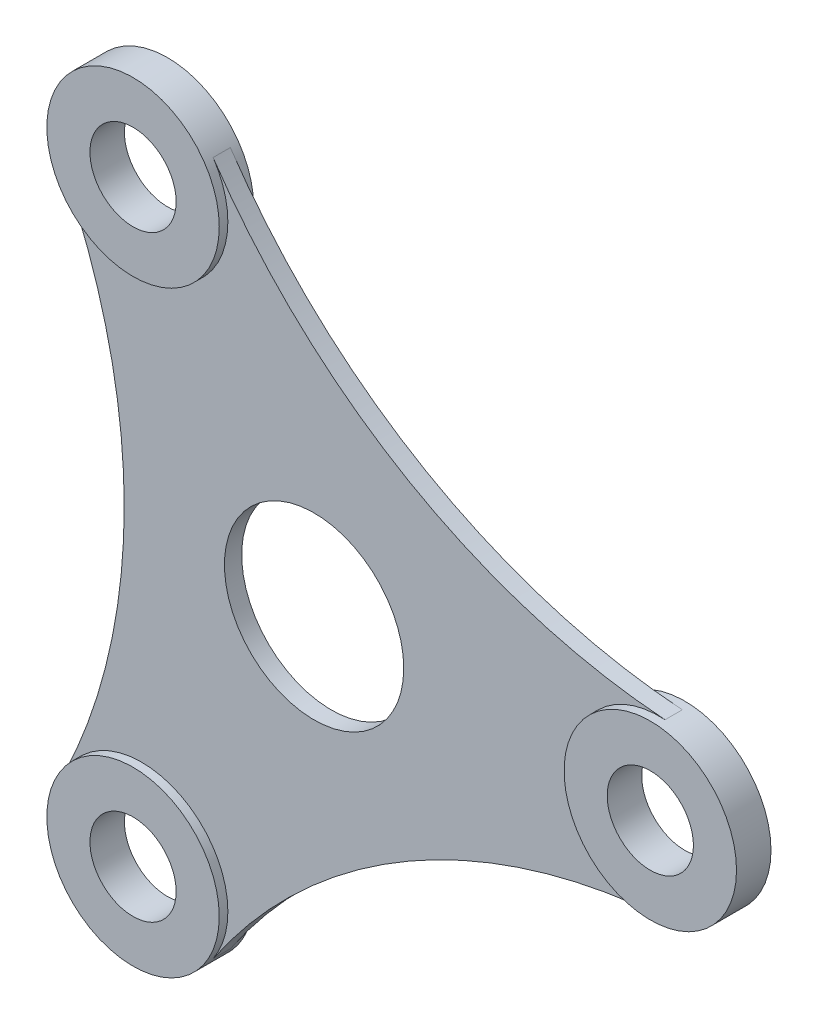
ISO-10303-21;
HEADER;
FILE_DESCRIPTION(('STEP AP214'),'2;1');
FILE_NAME('part.step','',(''),(''),'','','');
FILE_SCHEMA(('AUTOMOTIVE_DESIGN { 1 0 10303 214 1 1 1 1 }'));
ENDSEC;
DATA;
#1=APPLICATION_CONTEXT('core data for automotive mechanical design processes');
#2=APPLICATION_PROTOCOL_DEFINITION('international standard','automotive_design',2000,#1);
#3=PRODUCT_CONTEXT('',#1,'mechanical');
#4=PRODUCT('Part','Part','',(#3));
#5=PRODUCT_RELATED_PRODUCT_CATEGORY('part','',(#4));
#6=PRODUCT_DEFINITION_FORMATION('','',#4);
#7=PRODUCT_DEFINITION_CONTEXT('part definition',#1,'design');
#8=PRODUCT_DEFINITION('design','',#6,#7);
#9=PRODUCT_DEFINITION_SHAPE('','',#8);
#10=(LENGTH_UNIT() NAMED_UNIT(*) SI_UNIT(.MILLI.,.METRE.));
#11=(NAMED_UNIT(*) PLANE_ANGLE_UNIT() SI_UNIT($,.RADIAN.));
#12=(NAMED_UNIT(*) SI_UNIT($,.STERADIAN.) SOLID_ANGLE_UNIT());
#13=UNCERTAINTY_MEASURE_WITH_UNIT(LENGTH_MEASURE(1.E-05),#10,'distance_accuracy_value','');
#14=(GEOMETRIC_REPRESENTATION_CONTEXT(3) GLOBAL_UNCERTAINTY_ASSIGNED_CONTEXT((#13)) GLOBAL_UNIT_ASSIGNED_CONTEXT((#10,
#11,#12)) REPRESENTATION_CONTEXT('',''));
#15=CARTESIAN_POINT('',(0.,0.,0.));
#16=DIRECTION('',(0.,0.,1.));
#17=DIRECTION('',(1.,0.,0.));
#18=AXIS2_PLACEMENT_3D('',#15,#16,#17);
#19=CARTESIAN_POINT('',(-100.,173.205080756888,10.));
#20=DIRECTION('',(0.,0.,-1.));
#21=DIRECTION('',(-1.,0.,0.));
#22=AXIS2_PLACEMENT_3D('',#19,#20,#21);
#23=CYLINDRICAL_SURFACE('',#22,24.9999999999998);
#24=CARTESIAN_POINT('',(-100.,173.205080756888,10.));
#25=DIRECTION('',(0.,0.,1.));
#26=DIRECTION('',(1.,0.,0.));
#27=AXIS2_PLACEMENT_3D('',#24,#25,#26);
#28=CIRCLE('',#27,24.9999999999998);
#29=CARTESIAN_POINT('',(-75.0000000000003,173.205080756888,10.));
#30=VERTEX_POINT('',#29);
#31=EDGE_CURVE('E52',#30,#30,#28,.T.);
#32=ORIENTED_EDGE('',*,*,#31,.T.);
#33=EDGE_LOOP('',(#32));
#34=FACE_BOUND('',#33,.T.);
#35=CARTESIAN_POINT('',(-100.,173.205080756888,-10.));
#36=DIRECTION('',(0.,0.,1.));
#37=DIRECTION('',(1.,0.,0.));
#38=AXIS2_PLACEMENT_3D('',#35,#36,#37);
#39=CIRCLE('',#38,24.9999999999998);
#40=CARTESIAN_POINT('',(-75.0000000000003,173.205080756888,-10.));
#41=VERTEX_POINT('',#40);
#42=EDGE_CURVE('E151',#41,#41,#39,.T.);
#43=ORIENTED_EDGE('',*,*,#42,.F.);
#44=EDGE_LOOP('',(#43));
#45=FACE_BOUND('',#44,.T.);
#46=ADVANCED_FACE('F43',(#34,#45),#23,.F.);
#47=CARTESIAN_POINT('',(-100.,173.205080756888,10.));
#48=DIRECTION('',(0.,0.,-1.));
#49=DIRECTION('',(-1.,0.,0.));
#50=AXIS2_PLACEMENT_3D('',#47,#48,#49);
#51=CYLINDRICAL_SURFACE('',#50,49.9999999999994);
#52=DIRECTION('',(0.,0.,-1.));
#53=VECTOR('',#52,1.);
#54=CARTESIAN_POINT('',(-144.963679523342,151.335752378492,5.));
#55=LINE('',#54,#53);
#56=CARTESIAN_POINT('',(-144.963679523337,151.335752378495,5.));
#57=VERTEX_POINT('',#56);
#58=CARTESIAN_POINT('',(-144.963679523342,151.335752378492,-5.));
#59=VERTEX_POINT('',#58);
#60=EDGE_CURVE('E60',#57,#59,#55,.T.);
#61=ORIENTED_EDGE('',*,*,#60,.F.);
#62=CARTESIAN_POINT('',(-100.,173.205080756888,5.));
#63=DIRECTION('',(0.,0.,1.));
#64=DIRECTION('',(1.,0.,0.));
#65=AXIS2_PLACEMENT_3D('',#62,#63,#64);
#66=CIRCLE('',#65,49.9999999999994);
#67=CARTESIAN_POINT('',(-58.578766298934,201.210105282528,5.));
#68=VERTEX_POINT('',#67);
#69=EDGE_CURVE('E65',#57,#68,#66,.T.);
#70=ORIENTED_EDGE('',*,*,#69,.T.);
#71=DIRECTION('',(0.,0.,-1.));
#72=VECTOR('',#71,1.);
#73=CARTESIAN_POINT('',(-58.5787662989348,201.210105282528,5.));
#74=LINE('',#73,#72);
#75=CARTESIAN_POINT('',(-58.5787662989348,201.210105282528,-5.));
#76=VERTEX_POINT('',#75);
#77=EDGE_CURVE('E120',#68,#76,#74,.T.);
#78=ORIENTED_EDGE('',*,*,#77,.T.);
#79=CARTESIAN_POINT('',(-100.,173.205080756888,-5.));
#80=DIRECTION('',(0.,0.,1.));
#81=DIRECTION('',(1.,0.,0.));
#82=AXIS2_PLACEMENT_3D('',#79,#80,#81);
#83=CIRCLE('',#82,49.9999999999994);
#84=EDGE_CURVE('E125',#59,#76,#83,.T.);
#85=ORIENTED_EDGE('',*,*,#84,.F.);
#86=EDGE_LOOP('',(#61,#70,#78,#85));
#87=FACE_BOUND('',#86,.T.);
#88=CARTESIAN_POINT('',(-100.,173.205080756888,10.));
#89=DIRECTION('',(0.,0.,1.));
#90=DIRECTION('',(1.,0.,0.));
#91=AXIS2_PLACEMENT_3D('',#88,#89,#90);
#92=CIRCLE('',#91,49.9999999999994);
#93=CARTESIAN_POINT('',(-50.0000000000007,173.205080756888,10.));
#94=VERTEX_POINT('',#93);
#95=EDGE_CURVE('E11',#94,#94,#92,.T.);
#96=ORIENTED_EDGE('',*,*,#95,.F.);
#97=EDGE_LOOP('',(#96));
#98=FACE_BOUND('',#97,.T.);
#99=CARTESIAN_POINT('',(-100.,173.205080756888,-10.));
#100=DIRECTION('',(0.,0.,1.));
#101=DIRECTION('',(1.,0.,0.));
#102=AXIS2_PLACEMENT_3D('',#99,#100,#101);
#103=CIRCLE('',#102,49.9999999999994);
#104=CARTESIAN_POINT('',(-50.0000000000007,173.205080756888,-10.));
#105=VERTEX_POINT('',#104);
#106=EDGE_CURVE('E46',#105,#105,#103,.T.);
#107=ORIENTED_EDGE('',*,*,#106,.T.);
#108=EDGE_LOOP('',(#107));
#109=FACE_BOUND('',#108,.T.);
#110=ADVANCED_FACE('F162',(#87,#98,#109),#51,.T.);
#111=CARTESIAN_POINT('',(0.,0.,10.));
#112=DIRECTION('',(0.,0.,1.));
#113=DIRECTION('',(1.,0.,0.));
#114=AXIS2_PLACEMENT_3D('',#111,#112,#113);
#115=PLANE('',#114);
#116=ORIENTED_EDGE('',*,*,#31,.F.);
#117=EDGE_LOOP('',(#116));
#118=FACE_BOUND('',#117,.T.);
#119=ORIENTED_EDGE('',*,*,#95,.T.);
#120=EDGE_LOOP('',(#119));
#121=FACE_BOUND('',#120,.T.);
#122=ADVANCED_FACE('F167',(#118,#121),#115,.T.);
#123=CARTESIAN_POINT('',(0.,0.,-10.));
#124=DIRECTION('',(0.,0.,1.));
#125=DIRECTION('',(1.,0.,0.));
#126=AXIS2_PLACEMENT_3D('',#123,#124,#125);
#127=PLANE('',#126);
#128=ORIENTED_EDGE('',*,*,#42,.T.);
#129=EDGE_LOOP('',(#128));
#130=FACE_BOUND('',#129,.T.);
#131=ORIENTED_EDGE('',*,*,#106,.F.);
#132=EDGE_LOOP('',(#131));
#133=FACE_BOUND('',#132,.T.);
#134=ADVANCED_FACE('F164',(#130,#133),#127,.F.);
#135=CARTESIAN_POINT('',(-456.112341824865,-4.04813530012713E-12,5.));
#136=DIRECTION('',(0.,0.,-1.));
#137=DIRECTION('',(-1.,0.,0.));
#138=AXIS2_PLACEMENT_3D('',#135,#136,#137);
#139=CYLINDRICAL_SURFACE('',#138,345.999999999995);
#140=CARTESIAN_POINT('',(-456.112341824865,-4.04813530012713E-12,-5.));
#141=DIRECTION('',(0.,0.,1.));
#142=DIRECTION('',(1.,0.,0.));
#143=AXIS2_PLACEMENT_3D('',#140,#141,#142);
#144=CIRCLE('',#143,345.999999999995);
#145=CARTESIAN_POINT('',(-144.963679523342,-151.335752378493,-5.));
#146=VERTEX_POINT('',#145);
#147=EDGE_CURVE('E375',#146,#59,#144,.T.);
#148=ORIENTED_EDGE('',*,*,#147,.F.);
#149=DIRECTION('',(0.,0.,-1.));
#150=VECTOR('',#149,1.);
#151=CARTESIAN_POINT('',(-144.963679523342,-151.335752378493,5.));
#152=LINE('',#151,#150);
#153=CARTESIAN_POINT('',(-144.963679523334,-151.335752378497,5.));
#154=VERTEX_POINT('',#153);
#155=EDGE_CURVE('E148',#154,#146,#152,.T.);
#156=ORIENTED_EDGE('',*,*,#155,.F.);
#157=CARTESIAN_POINT('',(-456.112341824865,-4.04813530012713E-12,5.));
#158=DIRECTION('',(0.,0.,1.));
#159=DIRECTION('',(1.,0.,0.));
#160=AXIS2_PLACEMENT_3D('',#157,#158,#159);
#161=CIRCLE('',#160,345.999999999995);
#162=EDGE_CURVE('E136',#154,#57,#161,.T.);
#163=ORIENTED_EDGE('',*,*,#162,.T.);
#164=ORIENTED_EDGE('',*,*,#60,.T.);
#165=EDGE_LOOP('',(#148,#156,#163,#164));
#166=FACE_BOUND('',#165,.T.);
#167=ADVANCED_FACE('F166',(#166),#139,.F.);
#168=CARTESIAN_POINT('',(228.056170912451,-395.004874999946,5.));
#169=DIRECTION('',(0.,0.,-1.));
#170=DIRECTION('',(-1.,0.,0.));
#171=AXIS2_PLACEMENT_3D('',#168,#169,#170);
#172=CYLINDRICAL_SURFACE('',#171,345.999999999996);
#173=CARTESIAN_POINT('',(228.056170912451,-395.004874999946,-5.));
#174=DIRECTION('',(0.,0.,1.));
#175=DIRECTION('',(1.,0.,0.));
#176=AXIS2_PLACEMENT_3D('',#173,#174,#175);
#177=CIRCLE('',#176,345.999999999996);
#178=CARTESIAN_POINT('',(203.542445822279,-49.8743529040348,-5.));
#179=VERTEX_POINT('',#178);
#180=CARTESIAN_POINT('',(-58.5787662989327,-201.210105282527,-5.));
#181=VERTEX_POINT('',#180);
#182=EDGE_CURVE('E110',#179,#181,#177,.T.);
#183=ORIENTED_EDGE('',*,*,#182,.F.);
#184=DIRECTION('',(0.,0.,-1.));
#185=VECTOR('',#184,1.);
#186=CARTESIAN_POINT('',(203.542445822279,-49.8743529040348,5.));
#187=LINE('',#186,#185);
#188=CARTESIAN_POINT('',(203.542445822279,-49.8743529040284,5.));
#189=VERTEX_POINT('',#188);
#190=EDGE_CURVE('E103',#189,#179,#187,.T.);
#191=ORIENTED_EDGE('',*,*,#190,.F.);
#192=CARTESIAN_POINT('',(228.056170912451,-395.004874999946,5.));
#193=DIRECTION('',(0.,0.,1.));
#194=DIRECTION('',(1.,0.,0.));
#195=AXIS2_PLACEMENT_3D('',#192,#193,#194);
#196=CIRCLE('',#195,345.999999999996);
#197=CARTESIAN_POINT('',(-58.5787662989334,-201.210105282526,5.));
#198=VERTEX_POINT('',#197);
#199=EDGE_CURVE('E385',#189,#198,#196,.T.);
#200=ORIENTED_EDGE('',*,*,#199,.T.);
#201=DIRECTION('',(0.,0.,-1.));
#202=VECTOR('',#201,1.);
#203=CARTESIAN_POINT('',(-58.5787662989327,-201.210105282527,5.));
#204=LINE('',#203,#202);
#205=EDGE_CURVE('E144',#198,#181,#204,.T.);
#206=ORIENTED_EDGE('',*,*,#205,.T.);
#207=EDGE_LOOP('',(#183,#191,#200,#206));
#208=FACE_BOUND('',#207,.T.);
#209=ADVANCED_FACE('F173',(#208),#172,.F.);
#210=CARTESIAN_POINT('',(228.05617091244,395.004874999957,5.));
#211=DIRECTION('',(0.,0.,-1.));
#212=DIRECTION('',(-1.,0.,0.));
#213=AXIS2_PLACEMENT_3D('',#210,#211,#212);
#214=CYLINDRICAL_SURFACE('',#213,345.999999999999);
#215=CARTESIAN_POINT('',(228.05617091244,395.004874999957,-5.));
#216=DIRECTION('',(0.,0.,1.));
#217=DIRECTION('',(1.,0.,0.));
#218=AXIS2_PLACEMENT_3D('',#215,#216,#217);
#219=CIRCLE('',#218,345.999999999999);
#220=CARTESIAN_POINT('',(203.542445822278,49.8743529040346,-5.));
#221=VERTEX_POINT('',#220);
#222=EDGE_CURVE('E109',#76,#221,#219,.T.);
#223=ORIENTED_EDGE('',*,*,#222,.F.);
#224=ORIENTED_EDGE('',*,*,#77,.F.);
#225=CARTESIAN_POINT('',(228.05617091244,395.004874999957,5.));
#226=DIRECTION('',(0.,0.,1.));
#227=DIRECTION('',(1.,0.,0.));
#228=AXIS2_PLACEMENT_3D('',#225,#226,#227);
#229=CIRCLE('',#228,345.999999999999);
#230=CARTESIAN_POINT('',(203.542445822278,49.8743529040356,5.));
#231=VERTEX_POINT('',#230);
#232=EDGE_CURVE('E118',#68,#231,#229,.T.);
#233=ORIENTED_EDGE('',*,*,#232,.T.);
#234=DIRECTION('',(0.,0.,-1.));
#235=VECTOR('',#234,1.);
#236=CARTESIAN_POINT('',(203.542445822278,49.8743529040346,5.));
#237=LINE('',#236,#235);
#238=EDGE_CURVE('E100',#231,#221,#237,.T.);
#239=ORIENTED_EDGE('',*,*,#238,.T.);
#240=EDGE_LOOP('',(#223,#224,#233,#239));
#241=FACE_BOUND('',#240,.T.);
#242=ADVANCED_FACE('F115',(#241),#214,.F.);
#243=CARTESIAN_POINT('',(0.,0.,5.));
#244=DIRECTION('',(0.,0.,-1.));
#245=DIRECTION('',(-1.,0.,0.));
#246=AXIS2_PLACEMENT_3D('',#243,#244,#245);
#247=CYLINDRICAL_SURFACE('',#246,52.);
#248=CARTESIAN_POINT('',(0.,0.,5.));
#249=DIRECTION('',(0.,0.,1.));
#250=DIRECTION('',(1.,0.,0.));
#251=AXIS2_PLACEMENT_3D('',#248,#249,#250);
#252=CIRCLE('',#251,52.);
#253=CARTESIAN_POINT('',(52.,0.,5.));
#254=VERTEX_POINT('',#253);
#255=EDGE_CURVE('E139',#254,#254,#252,.T.);
#256=ORIENTED_EDGE('',*,*,#255,.T.);
#257=EDGE_LOOP('',(#256));
#258=FACE_BOUND('',#257,.T.);
#259=CARTESIAN_POINT('',(0.,0.,-5.));
#260=DIRECTION('',(0.,0.,1.));
#261=DIRECTION('',(1.,0.,0.));
#262=AXIS2_PLACEMENT_3D('',#259,#260,#261);
#263=CIRCLE('',#262,52.);
#264=CARTESIAN_POINT('',(52.,0.,-5.));
#265=VERTEX_POINT('',#264);
#266=EDGE_CURVE('E129',#265,#265,#263,.T.);
#267=ORIENTED_EDGE('',*,*,#266,.F.);
#268=EDGE_LOOP('',(#267));
#269=FACE_BOUND('',#268,.T.);
#270=ADVANCED_FACE('F309',(#258,#269),#247,.F.);
#271=CARTESIAN_POINT('',(0.,0.,5.));
#272=DIRECTION('',(0.,0.,1.));
#273=DIRECTION('',(1.,0.,0.));
#274=AXIS2_PLACEMENT_3D('',#271,#272,#273);
#275=PLANE('',#274);
#276=ORIENTED_EDGE('',*,*,#162,.F.);
#277=CARTESIAN_POINT('',(-99.9999999999999,-173.205080756888,5.));
#278=DIRECTION('',(0.,0.,1.));
#279=DIRECTION('',(1.,0.,0.));
#280=AXIS2_PLACEMENT_3D('',#277,#278,#279);
#281=CIRCLE('',#280,49.9999999999997);
#282=EDGE_CURVE('E387',#198,#154,#281,.T.);
#283=ORIENTED_EDGE('',*,*,#282,.F.);
#284=ORIENTED_EDGE('',*,*,#199,.F.);
#285=CARTESIAN_POINT('',(200.,-6.52256026967279E-13,5.));
#286=DIRECTION('',(0.,0.,1.));
#287=DIRECTION('',(1.,0.,0.));
#288=AXIS2_PLACEMENT_3D('',#285,#286,#287);
#289=CIRCLE('',#288,50.0000000000001);
#290=EDGE_CURVE('E393',#231,#189,#289,.T.);
#291=ORIENTED_EDGE('',*,*,#290,.F.);
#292=ORIENTED_EDGE('',*,*,#232,.F.);
#293=ORIENTED_EDGE('',*,*,#69,.F.);
#294=EDGE_LOOP('',(#276,#283,#284,#291,#292,#293));
#295=FACE_BOUND('',#294,.T.);
#296=ORIENTED_EDGE('',*,*,#255,.F.);
#297=EDGE_LOOP('',(#296));
#298=FACE_BOUND('',#297,.T.);
#299=ADVANCED_FACE('F319',(#295,#298),#275,.T.);
#300=CARTESIAN_POINT('',(0.,0.,-5.));
#301=DIRECTION('',(0.,0.,1.));
#302=DIRECTION('',(1.,0.,0.));
#303=AXIS2_PLACEMENT_3D('',#300,#301,#302);
#304=PLANE('',#303);
#305=ORIENTED_EDGE('',*,*,#147,.T.);
#306=ORIENTED_EDGE('',*,*,#84,.T.);
#307=ORIENTED_EDGE('',*,*,#222,.T.);
#308=CARTESIAN_POINT('',(200.,-6.52256026967279E-13,-5.));
#309=DIRECTION('',(0.,0.,1.));
#310=DIRECTION('',(1.,0.,0.));
#311=AXIS2_PLACEMENT_3D('',#308,#309,#310);
#312=CIRCLE('',#311,50.0000000000001);
#313=EDGE_CURVE('E96',#221,#179,#312,.T.);
#314=ORIENTED_EDGE('',*,*,#313,.T.);
#315=ORIENTED_EDGE('',*,*,#182,.T.);
#316=CARTESIAN_POINT('',(-99.9999999999999,-173.205080756888,-5.));
#317=DIRECTION('',(0.,0.,1.));
#318=DIRECTION('',(1.,0.,0.));
#319=AXIS2_PLACEMENT_3D('',#316,#317,#318);
#320=CIRCLE('',#319,49.9999999999997);
#321=EDGE_CURVE('E378',#181,#146,#320,.T.);
#322=ORIENTED_EDGE('',*,*,#321,.T.);
#323=EDGE_LOOP('',(#305,#306,#307,#314,#315,#322));
#324=FACE_BOUND('',#323,.T.);
#325=ORIENTED_EDGE('',*,*,#266,.T.);
#326=EDGE_LOOP('',(#325));
#327=FACE_BOUND('',#326,.T.);
#328=ADVANCED_FACE('F123',(#324,#327),#304,.F.);
#329=CARTESIAN_POINT('',(-100.,-173.205080756888,10.));
#330=DIRECTION('',(0.,0.,-1.));
#331=DIRECTION('',(-1.,0.,0.));
#332=AXIS2_PLACEMENT_3D('',#329,#330,#331);
#333=CYLINDRICAL_SURFACE('',#332,25.0000000000018);
#334=CARTESIAN_POINT('',(-100.,-173.205080756888,10.));
#335=DIRECTION('',(0.,0.,1.));
#336=DIRECTION('',(1.,0.,0.));
#337=AXIS2_PLACEMENT_3D('',#334,#335,#336);
#338=CIRCLE('',#337,25.0000000000018);
#339=CARTESIAN_POINT('',(-74.9999999999982,-173.205080756888,10.));
#340=VERTEX_POINT('',#339);
#341=EDGE_CURVE('E404',#340,#340,#338,.T.);
#342=ORIENTED_EDGE('',*,*,#341,.T.);
#343=EDGE_LOOP('',(#342));
#344=FACE_BOUND('',#343,.T.);
#345=CARTESIAN_POINT('',(-100.,-173.205080756888,-10.));
#346=DIRECTION('',(0.,0.,1.));
#347=DIRECTION('',(1.,0.,0.));
#348=AXIS2_PLACEMENT_3D('',#345,#346,#347);
#349=CIRCLE('',#348,25.0000000000018);
#350=CARTESIAN_POINT('',(-74.9999999999982,-173.205080756888,-10.));
#351=VERTEX_POINT('',#350);
#352=EDGE_CURVE('E405',#351,#351,#349,.T.);
#353=ORIENTED_EDGE('',*,*,#352,.F.);
#354=EDGE_LOOP('',(#353));
#355=FACE_BOUND('',#354,.T.);
#356=ADVANCED_FACE('F210',(#344,#355),#333,.F.);
#357=CARTESIAN_POINT('',(-99.9999999999999,-173.205080756888,10.));
#358=DIRECTION('',(0.,0.,-1.));
#359=DIRECTION('',(-1.,0.,0.));
#360=AXIS2_PLACEMENT_3D('',#357,#358,#359);
#361=CYLINDRICAL_SURFACE('',#360,49.9999999999997);
#362=ORIENTED_EDGE('',*,*,#282,.T.);
#363=ORIENTED_EDGE('',*,*,#155,.T.);
#364=ORIENTED_EDGE('',*,*,#321,.F.);
#365=ORIENTED_EDGE('',*,*,#205,.F.);
#366=EDGE_LOOP('',(#362,#363,#364,#365));
#367=FACE_BOUND('',#366,.T.);
#368=CARTESIAN_POINT('',(-99.9999999999999,-173.205080756888,10.));
#369=DIRECTION('',(0.,0.,1.));
#370=DIRECTION('',(1.,0.,0.));
#371=AXIS2_PLACEMENT_3D('',#368,#369,#370);
#372=CIRCLE('',#371,49.9999999999997);
#373=CARTESIAN_POINT('',(-50.0000000000002,-173.205080756888,10.));
#374=VERTEX_POINT('',#373);
#375=EDGE_CURVE('E379',#374,#374,#372,.T.);
#376=ORIENTED_EDGE('',*,*,#375,.F.);
#377=EDGE_LOOP('',(#376));
#378=FACE_BOUND('',#377,.T.);
#379=CARTESIAN_POINT('',(-99.9999999999999,-173.205080756888,-10.));
#380=DIRECTION('',(0.,0.,1.));
#381=DIRECTION('',(1.,0.,0.));
#382=AXIS2_PLACEMENT_3D('',#379,#380,#381);
#383=CIRCLE('',#382,49.9999999999997);
#384=CARTESIAN_POINT('',(-50.0000000000002,-173.205080756888,-10.));
#385=VERTEX_POINT('',#384);
#386=EDGE_CURVE('E400',#385,#385,#383,.T.);
#387=ORIENTED_EDGE('',*,*,#386,.T.);
#388=EDGE_LOOP('',(#387));
#389=FACE_BOUND('',#388,.T.);
#390=ADVANCED_FACE('F215',(#367,#378,#389),#361,.T.);
#391=CARTESIAN_POINT('',(0.,0.,10.));
#392=DIRECTION('',(0.,0.,1.));
#393=DIRECTION('',(1.,0.,0.));
#394=AXIS2_PLACEMENT_3D('',#391,#392,#393);
#395=PLANE('',#394);
#396=ORIENTED_EDGE('',*,*,#341,.F.);
#397=EDGE_LOOP('',(#396));
#398=FACE_BOUND('',#397,.T.);
#399=ORIENTED_EDGE('',*,*,#375,.T.);
#400=EDGE_LOOP('',(#399));
#401=FACE_BOUND('',#400,.T.);
#402=ADVANCED_FACE('F225',(#398,#401),#395,.T.);
#403=CARTESIAN_POINT('',(0.,0.,-10.));
#404=DIRECTION('',(0.,0.,1.));
#405=DIRECTION('',(1.,0.,0.));
#406=AXIS2_PLACEMENT_3D('',#403,#404,#405);
#407=PLANE('',#406);
#408=ORIENTED_EDGE('',*,*,#352,.T.);
#409=EDGE_LOOP('',(#408));
#410=FACE_BOUND('',#409,.T.);
#411=ORIENTED_EDGE('',*,*,#386,.F.);
#412=EDGE_LOOP('',(#411));
#413=FACE_BOUND('',#412,.T.);
#414=ADVANCED_FACE('F235',(#410,#413),#407,.F.);
#415=CARTESIAN_POINT('',(200.,-6.52256026967279E-13,10.));
#416=DIRECTION('',(0.,0.,-1.));
#417=DIRECTION('',(-1.,0.,0.));
#418=AXIS2_PLACEMENT_3D('',#415,#416,#417);
#419=CYLINDRICAL_SURFACE('',#418,25.);
#420=CARTESIAN_POINT('',(200.,-6.52256026967279E-13,10.));
#421=DIRECTION('',(0.,0.,1.));
#422=DIRECTION('',(1.,0.,0.));
#423=AXIS2_PLACEMENT_3D('',#420,#421,#422);
#424=CIRCLE('',#423,25.);
#425=CARTESIAN_POINT('',(225.,-6.52256026967279E-13,10.));
#426=VERTEX_POINT('',#425);
#427=EDGE_CURVE('E420',#426,#426,#424,.T.);
#428=ORIENTED_EDGE('',*,*,#427,.T.);
#429=EDGE_LOOP('',(#428));
#430=FACE_BOUND('',#429,.T.);
#431=CARTESIAN_POINT('',(200.,-6.52256026967279E-13,-10.));
#432=DIRECTION('',(0.,0.,1.));
#433=DIRECTION('',(1.,0.,0.));
#434=AXIS2_PLACEMENT_3D('',#431,#432,#433);
#435=CIRCLE('',#434,25.);
#436=CARTESIAN_POINT('',(225.,-6.52256026967279E-13,-10.));
#437=VERTEX_POINT('',#436);
#438=EDGE_CURVE('E421',#437,#437,#435,.T.);
#439=ORIENTED_EDGE('',*,*,#438,.F.);
#440=EDGE_LOOP('',(#439));
#441=FACE_BOUND('',#440,.T.);
#442=ADVANCED_FACE('F245',(#430,#441),#419,.F.);
#443=CARTESIAN_POINT('',(200.,-6.52256026967279E-13,10.));
#444=DIRECTION('',(0.,0.,-1.));
#445=DIRECTION('',(-1.,0.,0.));
#446=AXIS2_PLACEMENT_3D('',#443,#444,#445);
#447=CYLINDRICAL_SURFACE('',#446,50.0000000000001);
#448=ORIENTED_EDGE('',*,*,#290,.T.);
#449=ORIENTED_EDGE('',*,*,#190,.T.);
#450=ORIENTED_EDGE('',*,*,#313,.F.);
#451=ORIENTED_EDGE('',*,*,#238,.F.);
#452=EDGE_LOOP('',(#448,#449,#450,#451));
#453=FACE_BOUND('',#452,.T.);
#454=CARTESIAN_POINT('',(200.,-6.52256026967279E-13,10.));
#455=DIRECTION('',(0.,0.,1.));
#456=DIRECTION('',(1.,0.,0.));
#457=AXIS2_PLACEMENT_3D('',#454,#455,#456);
#458=CIRCLE('',#457,50.0000000000001);
#459=CARTESIAN_POINT('',(250.,-6.52256026967279E-13,10.));
#460=VERTEX_POINT('',#459);
#461=EDGE_CURVE('E409',#460,#460,#458,.T.);
#462=ORIENTED_EDGE('',*,*,#461,.F.);
#463=EDGE_LOOP('',(#462));
#464=FACE_BOUND('',#463,.T.);
#465=CARTESIAN_POINT('',(200.,-6.52256026967279E-13,-10.));
#466=DIRECTION('',(0.,0.,1.));
#467=DIRECTION('',(1.,0.,0.));
#468=AXIS2_PLACEMENT_3D('',#465,#466,#467);
#469=CIRCLE('',#468,50.0000000000001);
#470=CARTESIAN_POINT('',(250.,-6.52256026967279E-13,-10.));
#471=VERTEX_POINT('',#470);
#472=EDGE_CURVE('E416',#471,#471,#469,.T.);
#473=ORIENTED_EDGE('',*,*,#472,.T.);
#474=EDGE_LOOP('',(#473));
#475=FACE_BOUND('',#474,.T.);
#476=ADVANCED_FACE('F98',(#453,#464,#475),#447,.T.);
#477=CARTESIAN_POINT('',(0.,0.,10.));
#478=DIRECTION('',(0.,0.,1.));
#479=DIRECTION('',(1.,0.,0.));
#480=AXIS2_PLACEMENT_3D('',#477,#478,#479);
#481=PLANE('',#480);
#482=ORIENTED_EDGE('',*,*,#427,.F.);
#483=EDGE_LOOP('',(#482));
#484=FACE_BOUND('',#483,.T.);
#485=ORIENTED_EDGE('',*,*,#461,.T.);
#486=EDGE_LOOP('',(#485));
#487=FACE_BOUND('',#486,.T.);
#488=ADVANCED_FACE('F264',(#484,#487),#481,.T.);
#489=CARTESIAN_POINT('',(0.,0.,-10.));
#490=DIRECTION('',(0.,0.,1.));
#491=DIRECTION('',(1.,0.,0.));
#492=AXIS2_PLACEMENT_3D('',#489,#490,#491);
#493=PLANE('',#492);
#494=ORIENTED_EDGE('',*,*,#438,.T.);
#495=EDGE_LOOP('',(#494));
#496=FACE_BOUND('',#495,.T.);
#497=ORIENTED_EDGE('',*,*,#472,.F.);
#498=EDGE_LOOP('',(#497));
#499=FACE_BOUND('',#498,.T.);
#500=ADVANCED_FACE('F273',(#496,#499),#493,.F.);
#501=CLOSED_SHELL('',(#46,#110,#122,#134,#167,#209,#242,#270,#299,#328,#356,#390,#402,#414,#442,
#476,#488,#500));
#502=MANIFOLD_SOLID_BREP('B2',#501);
#503=ADVANCED_BREP_SHAPE_REPRESENTATION('',(#18,#502),#14);
#504=SHAPE_DEFINITION_REPRESENTATION(#9,#503);
ENDSEC;
END-ISO-10303-21;
